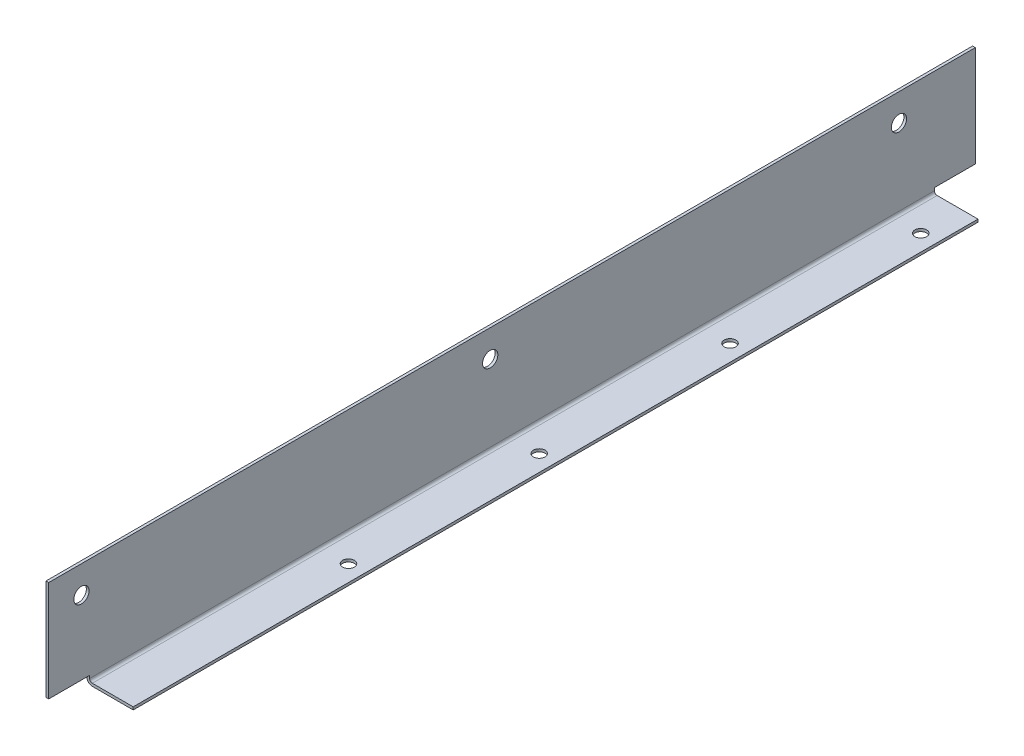
ISO-10303-21;
HEADER;
FILE_DESCRIPTION(('STEP AP214'),'2;1');
FILE_NAME('part.step','',(''),(''),'','','');
FILE_SCHEMA(('AUTOMOTIVE_DESIGN { 1 0 10303 214 1 1 1 1 }'));
ENDSEC;
DATA;
#1=APPLICATION_CONTEXT('core data for automotive mechanical design processes');
#2=APPLICATION_PROTOCOL_DEFINITION('international standard','automotive_design',2000,#1);
#3=PRODUCT_CONTEXT('',#1,'mechanical');
#4=PRODUCT('Part','Part','',(#3));
#5=PRODUCT_RELATED_PRODUCT_CATEGORY('part','',(#4));
#6=PRODUCT_DEFINITION_FORMATION('','',#4);
#7=PRODUCT_DEFINITION_CONTEXT('part definition',#1,'design');
#8=PRODUCT_DEFINITION('design','',#6,#7);
#9=PRODUCT_DEFINITION_SHAPE('','',#8);
#10=(LENGTH_UNIT() NAMED_UNIT(*) SI_UNIT(.MILLI.,.METRE.));
#11=(NAMED_UNIT(*) PLANE_ANGLE_UNIT() SI_UNIT($,.RADIAN.));
#12=(NAMED_UNIT(*) SI_UNIT($,.STERADIAN.) SOLID_ANGLE_UNIT());
#13=UNCERTAINTY_MEASURE_WITH_UNIT(LENGTH_MEASURE(1.E-05),#10,'distance_accuracy_value','');
#14=(GEOMETRIC_REPRESENTATION_CONTEXT(3) GLOBAL_UNCERTAINTY_ASSIGNED_CONTEXT((#13)) GLOBAL_UNIT_ASSIGNED_CONTEXT((#10,
#11,#12)) REPRESENTATION_CONTEXT('',''));
#15=CARTESIAN_POINT('',(0.,0.,0.));
#16=DIRECTION('',(0.,0.,1.));
#17=DIRECTION('',(1.,0.,0.));
#18=AXIS2_PLACEMENT_3D('',#15,#16,#17);
#19=CARTESIAN_POINT('',(17.,1.,340.));
#20=DIRECTION('',(-1.,0.,0.));
#21=DIRECTION('',(0.,0.,1.));
#22=AXIS2_PLACEMENT_3D('',#19,#20,#21);
#23=PLANE('',#22);
#24=DIRECTION('',(0.,0.,-1.));
#25=VECTOR('',#24,1.);
#26=CARTESIAN_POINT('',(17.,0.,340.));
#27=LINE('',#26,#25);
#28=CARTESIAN_POINT('',(17.,0.,325.));
#29=VERTEX_POINT('',#28);
#30=CARTESIAN_POINT('',(17.,0.,15.));
#31=VERTEX_POINT('',#30);
#32=EDGE_CURVE('E137',#29,#31,#27,.T.);
#33=ORIENTED_EDGE('',*,*,#32,.T.);
#34=DIRECTION('',(0.,1.,0.));
#35=VECTOR('',#34,1.);
#36=CARTESIAN_POINT('',(17.,1.,15.));
#37=LINE('',#36,#35);
#38=CARTESIAN_POINT('',(17.,1.,15.));
#39=VERTEX_POINT('',#38);
#40=EDGE_CURVE('E119',#31,#39,#37,.T.);
#41=ORIENTED_EDGE('',*,*,#40,.T.);
#42=DIRECTION('',(0.,0.,-1.));
#43=VECTOR('',#42,1.);
#44=CARTESIAN_POINT('',(17.,1.,340.));
#45=LINE('',#44,#43);
#46=CARTESIAN_POINT('',(17.,1.,325.));
#47=VERTEX_POINT('',#46);
#48=EDGE_CURVE('E169',#47,#39,#45,.T.);
#49=ORIENTED_EDGE('',*,*,#48,.F.);
#50=DIRECTION('',(0.,-1.,0.));
#51=VECTOR('',#50,1.);
#52=CARTESIAN_POINT('',(17.,1.,325.));
#53=LINE('',#52,#51);
#54=EDGE_CURVE('E143',#47,#29,#53,.T.);
#55=ORIENTED_EDGE('',*,*,#54,.T.);
#56=EDGE_LOOP('',(#33,#41,#49,#55));
#57=FACE_BOUND('',#56,.T.);
#58=ADVANCED_FACE('F31',(#57),#23,.F.);
#59=CARTESIAN_POINT('',(17.,1.,340.));
#60=DIRECTION('',(0.,-1.,0.));
#61=DIRECTION('',(0.,0.,-1.));
#62=AXIS2_PLACEMENT_3D('',#59,#60,#61);
#63=PLANE('',#62);
#64=CARTESIAN_POINT('',(11.,1.,240.));
#65=DIRECTION('',(0.,-1.,0.));
#66=DIRECTION('',(0.,0.,-1.));
#67=AXIS2_PLACEMENT_3D('',#64,#65,#66);
#68=CIRCLE('',#67,2.15000000000001);
#69=CARTESIAN_POINT('',(11.,1.,237.85));
#70=VERTEX_POINT('',#69);
#71=EDGE_CURVE('E243',#70,#70,#68,.T.);
#72=ORIENTED_EDGE('',*,*,#71,.T.);
#73=EDGE_LOOP('',(#72));
#74=FACE_BOUND('',#73,.T.);
#75=CARTESIAN_POINT('',(11.,1.,170.));
#76=DIRECTION('',(0.,-1.,0.));
#77=DIRECTION('',(0.,0.,-1.));
#78=AXIS2_PLACEMENT_3D('',#75,#76,#77);
#79=CIRCLE('',#78,2.15000000000001);
#80=CARTESIAN_POINT('',(11.,1.,167.85));
#81=VERTEX_POINT('',#80);
#82=EDGE_CURVE('E249',#81,#81,#79,.T.);
#83=ORIENTED_EDGE('',*,*,#82,.T.);
#84=EDGE_LOOP('',(#83));
#85=FACE_BOUND('',#84,.T.);
#86=CARTESIAN_POINT('',(11.,1.,100.));
#87=DIRECTION('',(0.,-1.,0.));
#88=DIRECTION('',(0.,0.,-1.));
#89=AXIS2_PLACEMENT_3D('',#86,#87,#88);
#90=CIRCLE('',#89,2.15);
#91=CARTESIAN_POINT('',(11.,1.,97.85));
#92=VERTEX_POINT('',#91);
#93=EDGE_CURVE('E255',#92,#92,#90,.T.);
#94=ORIENTED_EDGE('',*,*,#93,.T.);
#95=EDGE_LOOP('',(#94));
#96=FACE_BOUND('',#95,.T.);
#97=CARTESIAN_POINT('',(11.,1.,30.));
#98=DIRECTION('',(0.,-1.,0.));
#99=DIRECTION('',(0.,0.,-1.));
#100=AXIS2_PLACEMENT_3D('',#97,#98,#99);
#101=CIRCLE('',#100,2.15);
#102=CARTESIAN_POINT('',(11.,1.,27.85));
#103=VERTEX_POINT('',#102);
#104=EDGE_CURVE('E261',#103,#103,#101,.T.);
#105=ORIENTED_EDGE('',*,*,#104,.T.);
#106=EDGE_LOOP('',(#105));
#107=FACE_BOUND('',#106,.T.);
#108=ORIENTED_EDGE('',*,*,#48,.T.);
#109=DIRECTION('',(-1.,0.,0.));
#110=VECTOR('',#109,1.);
#111=CARTESIAN_POINT('',(17.,1.,15.));
#112=LINE('',#111,#110);
#113=CARTESIAN_POINT('',(2.00000000000002,1.,15.));
#114=VERTEX_POINT('',#113);
#115=EDGE_CURVE('E125',#39,#114,#112,.T.);
#116=ORIENTED_EDGE('',*,*,#115,.T.);
#117=DIRECTION('',(0.,0.,-1.));
#118=VECTOR('',#117,1.);
#119=CARTESIAN_POINT('',(2.00000000000002,1.,340.));
#120=LINE('',#119,#118);
#121=CARTESIAN_POINT('',(2.00000000000002,1.,325.));
#122=VERTEX_POINT('',#121);
#123=EDGE_CURVE('E166',#122,#114,#120,.T.);
#124=ORIENTED_EDGE('',*,*,#123,.F.);
#125=DIRECTION('',(1.,0.,0.));
#126=VECTOR('',#125,1.);
#127=CARTESIAN_POINT('',(17.,1.,325.));
#128=LINE('',#127,#126);
#129=EDGE_CURVE('E236',#122,#47,#128,.T.);
#130=ORIENTED_EDGE('',*,*,#129,.T.);
#131=EDGE_LOOP('',(#108,#116,#124,#130));
#132=FACE_BOUND('',#131,.T.);
#133=ADVANCED_FACE('F297',(#74,#85,#96,#107,#132),#63,.F.);
#134=CARTESIAN_POINT('',(2.,2.,340.));
#135=DIRECTION('',(0.,0.,-1.));
#136=DIRECTION('',(-1.,0.,0.));
#137=AXIS2_PLACEMENT_3D('',#134,#135,#136);
#138=CYLINDRICAL_SURFACE('',#137,1.);
#139=ORIENTED_EDGE('',*,*,#123,.T.);
#140=CARTESIAN_POINT('',(2.,2.,15.));
#141=DIRECTION('',(0.,0.,1.));
#142=DIRECTION('',(1.,0.,0.));
#143=AXIS2_PLACEMENT_3D('',#140,#141,#142);
#144=CIRCLE('',#143,1.);
#145=CARTESIAN_POINT('',(1.,2.00000000000001,15.));
#146=VERTEX_POINT('',#145);
#147=EDGE_CURVE('E215',#114,#146,#144,.F.);
#148=ORIENTED_EDGE('',*,*,#147,.T.);
#149=DIRECTION('',(0.,0.,-1.));
#150=VECTOR('',#149,1.);
#151=CARTESIAN_POINT('',(1.,2.00000000000001,340.));
#152=LINE('',#151,#150);
#153=CARTESIAN_POINT('',(1.,2.00000000000001,325.));
#154=VERTEX_POINT('',#153);
#155=EDGE_CURVE('E163',#154,#146,#152,.T.);
#156=ORIENTED_EDGE('',*,*,#155,.F.);
#157=CARTESIAN_POINT('',(2.,2.,325.));
#158=DIRECTION('',(0.,0.,-1.));
#159=DIRECTION('',(-1.,0.,0.));
#160=AXIS2_PLACEMENT_3D('',#157,#158,#159);
#161=CIRCLE('',#160,1.);
#162=EDGE_CURVE('E233',#154,#122,#161,.F.);
#163=ORIENTED_EDGE('',*,*,#162,.T.);
#164=EDGE_LOOP('',(#139,#148,#156,#163));
#165=FACE_BOUND('',#164,.T.);
#166=ADVANCED_FACE('F301',(#165),#138,.F.);
#167=CARTESIAN_POINT('',(1.,2.00000000000001,340.));
#168=DIRECTION('',(-1.,0.,0.));
#169=DIRECTION('',(0.,0.,1.));
#170=AXIS2_PLACEMENT_3D('',#167,#168,#169);
#171=PLANE('',#170);
#172=CARTESIAN_POINT('',(1.,30.,328.));
#173=DIRECTION('',(-1.,0.,0.));
#174=DIRECTION('',(0.,0.,1.));
#175=AXIS2_PLACEMENT_3D('',#172,#173,#174);
#176=CIRCLE('',#175,2.80000000000001);
#177=CARTESIAN_POINT('',(1.,30.,330.8));
#178=VERTEX_POINT('',#177);
#179=EDGE_CURVE('E267',#178,#178,#176,.T.);
#180=ORIENTED_EDGE('',*,*,#179,.T.);
#181=EDGE_LOOP('',(#180));
#182=FACE_BOUND('',#181,.T.);
#183=CARTESIAN_POINT('',(1.,30.,178.));
#184=DIRECTION('',(-1.,0.,0.));
#185=DIRECTION('',(0.,0.,1.));
#186=AXIS2_PLACEMENT_3D('',#183,#184,#185);
#187=CIRCLE('',#186,2.80000000000001);
#188=CARTESIAN_POINT('',(1.,30.,180.8));
#189=VERTEX_POINT('',#188);
#190=EDGE_CURVE('E273',#189,#189,#187,.T.);
#191=ORIENTED_EDGE('',*,*,#190,.T.);
#192=EDGE_LOOP('',(#191));
#193=FACE_BOUND('',#192,.T.);
#194=CARTESIAN_POINT('',(1.,30.,28.));
#195=DIRECTION('',(-1.,0.,0.));
#196=DIRECTION('',(0.,0.,1.));
#197=AXIS2_PLACEMENT_3D('',#194,#195,#196);
#198=CIRCLE('',#197,2.8);
#199=CARTESIAN_POINT('',(1.,30.,30.8));
#200=VERTEX_POINT('',#199);
#201=EDGE_CURVE('E186',#200,#200,#198,.T.);
#202=ORIENTED_EDGE('',*,*,#201,.T.);
#203=EDGE_LOOP('',(#202));
#204=FACE_BOUND('',#203,.T.);
#205=ORIENTED_EDGE('',*,*,#155,.T.);
#206=DIRECTION('',(0.,1.,0.));
#207=VECTOR('',#206,1.);
#208=CARTESIAN_POINT('',(1.,2.00000000000001,15.));
#209=LINE('',#208,#207);
#210=CARTESIAN_POINT('',(1.,3.,15.));
#211=VERTEX_POINT('',#210);
#212=EDGE_CURVE('E205',#146,#211,#209,.T.);
#213=ORIENTED_EDGE('',*,*,#212,.T.);
#214=DIRECTION('',(0.,0.,-1.));
#215=VECTOR('',#214,1.);
#216=CARTESIAN_POINT('',(1.,3.,340.));
#217=LINE('',#216,#215);
#218=CARTESIAN_POINT('',(1.,3.,0.));
#219=VERTEX_POINT('',#218);
#220=EDGE_CURVE('E202',#211,#219,#217,.T.);
#221=ORIENTED_EDGE('',*,*,#220,.T.);
#222=DIRECTION('',(0.,1.,0.));
#223=VECTOR('',#222,1.);
#224=CARTESIAN_POINT('',(1.,2.00000000000001,0.));
#225=LINE('',#224,#223);
#226=CARTESIAN_POINT('',(1.,40.,0.));
#227=VERTEX_POINT('',#226);
#228=EDGE_CURVE('E189',#219,#227,#225,.T.);
#229=ORIENTED_EDGE('',*,*,#228,.T.);
#230=DIRECTION('',(0.,0.,-1.));
#231=VECTOR('',#230,1.);
#232=CARTESIAN_POINT('',(1.,40.,340.));
#233=LINE('',#232,#231);
#234=CARTESIAN_POINT('',(1.,40.,340.));
#235=VERTEX_POINT('',#234);
#236=EDGE_CURVE('E160',#235,#227,#233,.T.);
#237=ORIENTED_EDGE('',*,*,#236,.F.);
#238=DIRECTION('',(0.,1.,0.));
#239=VECTOR('',#238,1.);
#240=CARTESIAN_POINT('',(1.,2.00000000000001,340.));
#241=LINE('',#240,#239);
#242=CARTESIAN_POINT('',(1.,3.,340.));
#243=VERTEX_POINT('',#242);
#244=EDGE_CURVE('E173',#243,#235,#241,.T.);
#245=ORIENTED_EDGE('',*,*,#244,.F.);
#246=DIRECTION('',(0.,0.,-1.));
#247=VECTOR('',#246,1.);
#248=CARTESIAN_POINT('',(1.,3.,340.));
#249=LINE('',#248,#247);
#250=CARTESIAN_POINT('',(0.999999999999999,3.,325.));
#251=VERTEX_POINT('',#250);
#252=EDGE_CURVE('E52',#243,#251,#249,.T.);
#253=ORIENTED_EDGE('',*,*,#252,.T.);
#254=DIRECTION('',(0.,-1.,0.));
#255=VECTOR('',#254,1.);
#256=CARTESIAN_POINT('',(1.,2.00000000000001,325.));
#257=LINE('',#256,#255);
#258=EDGE_CURVE('E231',#251,#154,#257,.T.);
#259=ORIENTED_EDGE('',*,*,#258,.T.);
#260=EDGE_LOOP('',(#205,#213,#221,#229,#237,#245,#253,#259));
#261=FACE_BOUND('',#260,.T.);
#262=ADVANCED_FACE('F178',(#182,#193,#204,#261),#171,.F.);
#263=CARTESIAN_POINT('',(0.,40.,340.));
#264=DIRECTION('',(0.,-1.,0.));
#265=DIRECTION('',(0.,0.,-1.));
#266=AXIS2_PLACEMENT_3D('',#263,#264,#265);
#267=PLANE('',#266);
#268=DIRECTION('',(-1.,0.,0.));
#269=VECTOR('',#268,1.);
#270=CARTESIAN_POINT('',(0.,40.,0.));
#271=LINE('',#270,#269);
#272=CARTESIAN_POINT('',(0.,40.,0.));
#273=VERTEX_POINT('',#272);
#274=EDGE_CURVE('E184',#227,#273,#271,.T.);
#275=ORIENTED_EDGE('',*,*,#274,.T.);
#276=DIRECTION('',(0.,0.,-1.));
#277=VECTOR('',#276,1.);
#278=CARTESIAN_POINT('',(0.,40.,340.));
#279=LINE('',#278,#277);
#280=CARTESIAN_POINT('',(0.,40.,340.));
#281=VERTEX_POINT('',#280);
#282=EDGE_CURVE('E157',#281,#273,#279,.T.);
#283=ORIENTED_EDGE('',*,*,#282,.F.);
#284=DIRECTION('',(-1.,0.,0.));
#285=VECTOR('',#284,1.);
#286=CARTESIAN_POINT('',(0.,40.,340.));
#287=LINE('',#286,#285);
#288=EDGE_CURVE('E149',#235,#281,#287,.T.);
#289=ORIENTED_EDGE('',*,*,#288,.F.);
#290=ORIENTED_EDGE('',*,*,#236,.T.);
#291=EDGE_LOOP('',(#275,#283,#289,#290));
#292=FACE_BOUND('',#291,.T.);
#293=ADVANCED_FACE('F193',(#292),#267,.F.);
#294=CARTESIAN_POINT('',(0.,2.00000000000001,340.));
#295=DIRECTION('',(1.,0.,0.));
#296=DIRECTION('',(0.,0.,-1.));
#297=AXIS2_PLACEMENT_3D('',#294,#295,#296);
#298=PLANE('',#297);
#299=CARTESIAN_POINT('',(0.,30.,328.));
#300=DIRECTION('',(-1.,0.,0.));
#301=DIRECTION('',(0.,0.,1.));
#302=AXIS2_PLACEMENT_3D('',#299,#300,#301);
#303=CIRCLE('',#302,2.80000000000001);
#304=CARTESIAN_POINT('',(0.,30.,330.8));
#305=VERTEX_POINT('',#304);
#306=EDGE_CURVE('E264',#305,#305,#303,.T.);
#307=ORIENTED_EDGE('',*,*,#306,.F.);
#308=EDGE_LOOP('',(#307));
#309=FACE_BOUND('',#308,.T.);
#310=CARTESIAN_POINT('',(0.,30.,178.));
#311=DIRECTION('',(-1.,0.,0.));
#312=DIRECTION('',(0.,0.,1.));
#313=AXIS2_PLACEMENT_3D('',#310,#311,#312);
#314=CIRCLE('',#313,2.80000000000001);
#315=CARTESIAN_POINT('',(0.,30.,180.8));
#316=VERTEX_POINT('',#315);
#317=EDGE_CURVE('E270',#316,#316,#314,.T.);
#318=ORIENTED_EDGE('',*,*,#317,.F.);
#319=EDGE_LOOP('',(#318));
#320=FACE_BOUND('',#319,.T.);
#321=CARTESIAN_POINT('',(0.,30.,28.));
#322=DIRECTION('',(-1.,0.,0.));
#323=DIRECTION('',(0.,0.,1.));
#324=AXIS2_PLACEMENT_3D('',#321,#322,#323);
#325=CIRCLE('',#324,2.8);
#326=CARTESIAN_POINT('',(0.,30.,30.8));
#327=VERTEX_POINT('',#326);
#328=EDGE_CURVE('E275',#327,#327,#325,.T.);
#329=ORIENTED_EDGE('',*,*,#328,.F.);
#330=EDGE_LOOP('',(#329));
#331=FACE_BOUND('',#330,.T.);
#332=DIRECTION('',(0.,0.,1.));
#333=VECTOR('',#332,1.);
#334=CARTESIAN_POINT('',(0.,3.,340.));
#335=LINE('',#334,#333);
#336=CARTESIAN_POINT('',(0.,3.,0.));
#337=VERTEX_POINT('',#336);
#338=CARTESIAN_POINT('',(0.,3.,15.));
#339=VERTEX_POINT('',#338);
#340=EDGE_CURVE('E44',#337,#339,#335,.T.);
#341=ORIENTED_EDGE('',*,*,#340,.T.);
#342=DIRECTION('',(0.,-1.,0.));
#343=VECTOR('',#342,1.);
#344=CARTESIAN_POINT('',(0.,2.00000000000001,15.));
#345=LINE('',#344,#343);
#346=CARTESIAN_POINT('',(0.,2.00000000000001,15.));
#347=VERTEX_POINT('',#346);
#348=EDGE_CURVE('E208',#339,#347,#345,.T.);
#349=ORIENTED_EDGE('',*,*,#348,.T.);
#350=DIRECTION('',(0.,0.,-1.));
#351=VECTOR('',#350,1.);
#352=CARTESIAN_POINT('',(0.,2.00000000000001,340.));
#353=LINE('',#352,#351);
#354=CARTESIAN_POINT('',(0.,2.,325.));
#355=VERTEX_POINT('',#354);
#356=EDGE_CURVE('E146',#355,#347,#353,.T.);
#357=ORIENTED_EDGE('',*,*,#356,.F.);
#358=DIRECTION('',(0.,1.,0.));
#359=VECTOR('',#358,1.);
#360=CARTESIAN_POINT('',(0.,2.00000000000001,325.));
#361=LINE('',#360,#359);
#362=CARTESIAN_POINT('',(0.,3.,325.));
#363=VERTEX_POINT('',#362);
#364=EDGE_CURVE('E228',#355,#363,#361,.T.);
#365=ORIENTED_EDGE('',*,*,#364,.T.);
#366=DIRECTION('',(0.,0.,1.));
#367=VECTOR('',#366,1.);
#368=CARTESIAN_POINT('',(0.,3.,340.));
#369=LINE('',#368,#367);
#370=CARTESIAN_POINT('',(0.,3.,340.));
#371=VERTEX_POINT('',#370);
#372=EDGE_CURVE('E221',#363,#371,#369,.T.);
#373=ORIENTED_EDGE('',*,*,#372,.T.);
#374=DIRECTION('',(0.,-1.,0.));
#375=VECTOR('',#374,1.);
#376=CARTESIAN_POINT('',(0.,2.00000000000001,340.));
#377=LINE('',#376,#375);
#378=EDGE_CURVE('E144',#281,#371,#377,.T.);
#379=ORIENTED_EDGE('',*,*,#378,.F.);
#380=ORIENTED_EDGE('',*,*,#282,.T.);
#381=DIRECTION('',(0.,-1.,0.));
#382=VECTOR('',#381,1.);
#383=CARTESIAN_POINT('',(0.,2.00000000000001,0.));
#384=LINE('',#383,#382);
#385=EDGE_CURVE('E152',#273,#337,#384,.T.);
#386=ORIENTED_EDGE('',*,*,#385,.T.);
#387=EDGE_LOOP('',(#341,#349,#357,#365,#373,#379,#380,#386));
#388=FACE_BOUND('',#387,.T.);
#389=ADVANCED_FACE('F198',(#309,#320,#331,#388),#298,.F.);
#390=CARTESIAN_POINT('',(2.,2.,340.));
#391=DIRECTION('',(0.,0.,-1.));
#392=DIRECTION('',(-1.,0.,0.));
#393=AXIS2_PLACEMENT_3D('',#390,#391,#392);
#394=CYLINDRICAL_SURFACE('',#393,2.);
#395=ORIENTED_EDGE('',*,*,#356,.T.);
#396=CARTESIAN_POINT('',(2.,2.,15.));
#397=DIRECTION('',(0.,0.,1.));
#398=DIRECTION('',(1.,0.,0.));
#399=AXIS2_PLACEMENT_3D('',#396,#397,#398);
#400=CIRCLE('',#399,2.);
#401=CARTESIAN_POINT('',(2.00000000000001,0.,15.));
#402=VERTEX_POINT('',#401);
#403=EDGE_CURVE('E206',#347,#402,#400,.T.);
#404=ORIENTED_EDGE('',*,*,#403,.T.);
#405=DIRECTION('',(0.,0.,-1.));
#406=VECTOR('',#405,1.);
#407=CARTESIAN_POINT('',(2.00000000000001,0.,340.));
#408=LINE('',#407,#406);
#409=CARTESIAN_POINT('',(2.00000000000001,0.,325.));
#410=VERTEX_POINT('',#409);
#411=EDGE_CURVE('E139',#410,#402,#408,.T.);
#412=ORIENTED_EDGE('',*,*,#411,.F.);
#413=CARTESIAN_POINT('',(2.,2.,325.));
#414=DIRECTION('',(0.,0.,-1.));
#415=DIRECTION('',(-1.,0.,0.));
#416=AXIS2_PLACEMENT_3D('',#413,#414,#415);
#417=CIRCLE('',#416,2.);
#418=EDGE_CURVE('E225',#410,#355,#417,.T.);
#419=ORIENTED_EDGE('',*,*,#418,.T.);
#420=EDGE_LOOP('',(#395,#404,#412,#419));
#421=FACE_BOUND('',#420,.T.);
#422=ADVANCED_FACE('F317',(#421),#394,.T.);
#423=CARTESIAN_POINT('',(17.,0.,340.));
#424=DIRECTION('',(0.,1.,0.));
#425=DIRECTION('',(-1.,0.,0.));
#426=AXIS2_PLACEMENT_3D('',#423,#424,#425);
#427=PLANE('',#426);
#428=CARTESIAN_POINT('',(11.,0.,240.));
#429=DIRECTION('',(0.,-1.,0.));
#430=DIRECTION('',(1.,0.,0.));
#431=AXIS2_PLACEMENT_3D('',#428,#429,#430);
#432=CIRCLE('',#431,2.15000000000001);
#433=CARTESIAN_POINT('',(13.15,0.,240.));
#434=VERTEX_POINT('',#433);
#435=EDGE_CURVE('E240',#434,#434,#432,.T.);
#436=ORIENTED_EDGE('',*,*,#435,.F.);
#437=EDGE_LOOP('',(#436));
#438=FACE_BOUND('',#437,.T.);
#439=CARTESIAN_POINT('',(11.,0.,170.));
#440=DIRECTION('',(0.,-1.,0.));
#441=DIRECTION('',(1.,0.,0.));
#442=AXIS2_PLACEMENT_3D('',#439,#440,#441);
#443=CIRCLE('',#442,2.15000000000001);
#444=CARTESIAN_POINT('',(13.15,0.,170.));
#445=VERTEX_POINT('',#444);
#446=EDGE_CURVE('E246',#445,#445,#443,.T.);
#447=ORIENTED_EDGE('',*,*,#446,.F.);
#448=EDGE_LOOP('',(#447));
#449=FACE_BOUND('',#448,.T.);
#450=CARTESIAN_POINT('',(11.,0.,100.));
#451=DIRECTION('',(0.,-1.,0.));
#452=DIRECTION('',(1.,0.,0.));
#453=AXIS2_PLACEMENT_3D('',#450,#451,#452);
#454=CIRCLE('',#453,2.15);
#455=CARTESIAN_POINT('',(13.15,0.,100.));
#456=VERTEX_POINT('',#455);
#457=EDGE_CURVE('E252',#456,#456,#454,.T.);
#458=ORIENTED_EDGE('',*,*,#457,.F.);
#459=EDGE_LOOP('',(#458));
#460=FACE_BOUND('',#459,.T.);
#461=CARTESIAN_POINT('',(11.,0.,30.));
#462=DIRECTION('',(0.,-1.,0.));
#463=DIRECTION('',(1.,0.,0.));
#464=AXIS2_PLACEMENT_3D('',#461,#462,#463);
#465=CIRCLE('',#464,2.15);
#466=CARTESIAN_POINT('',(13.15,0.,30.));
#467=VERTEX_POINT('',#466);
#468=EDGE_CURVE('E258',#467,#467,#465,.T.);
#469=ORIENTED_EDGE('',*,*,#468,.F.);
#470=EDGE_LOOP('',(#469));
#471=FACE_BOUND('',#470,.T.);
#472=ORIENTED_EDGE('',*,*,#411,.T.);
#473=DIRECTION('',(-1.,0.,0.));
#474=VECTOR('',#473,1.);
#475=CARTESIAN_POINT('',(-17.2737898080727,0.,15.));
#476=LINE('',#475,#474);
#477=EDGE_CURVE('E122',#31,#402,#476,.T.);
#478=ORIENTED_EDGE('',*,*,#477,.F.);
#479=ORIENTED_EDGE('',*,*,#32,.F.);
#480=DIRECTION('',(1.,0.,0.));
#481=VECTOR('',#480,1.);
#482=CARTESIAN_POINT('',(-12.3496219302459,0.,325.));
#483=LINE('',#482,#481);
#484=EDGE_CURVE('E130',#410,#29,#483,.T.);
#485=ORIENTED_EDGE('',*,*,#484,.F.);
#486=EDGE_LOOP('',(#472,#478,#479,#485));
#487=FACE_BOUND('',#486,.T.);
#488=ADVANCED_FACE('F135',(#438,#449,#460,#471,#487),#427,.F.);
#489=CARTESIAN_POINT('',(2.,2.,340.));
#490=DIRECTION('',(0.,0.,-1.));
#491=DIRECTION('',(-1.,0.,0.));
#492=AXIS2_PLACEMENT_3D('',#489,#490,#491);
#493=PLANE('',#492);
#494=ORIENTED_EDGE('',*,*,#378,.T.);
#495=DIRECTION('',(1.,0.,0.));
#496=VECTOR('',#495,1.);
#497=CARTESIAN_POINT('',(2.,3.,340.));
#498=LINE('',#497,#496);
#499=EDGE_CURVE('E38',#371,#243,#498,.T.);
#500=ORIENTED_EDGE('',*,*,#499,.T.);
#501=ORIENTED_EDGE('',*,*,#244,.T.);
#502=ORIENTED_EDGE('',*,*,#288,.T.);
#503=EDGE_LOOP('',(#494,#500,#501,#502));
#504=FACE_BOUND('',#503,.T.);
#505=ADVANCED_FACE('F172',(#504),#493,.F.);
#506=CARTESIAN_POINT('',(2.,2.,0.));
#507=DIRECTION('',(0.,0.,-1.));
#508=DIRECTION('',(-1.,0.,0.));
#509=AXIS2_PLACEMENT_3D('',#506,#507,#508);
#510=PLANE('',#509);
#511=DIRECTION('',(1.,0.,0.));
#512=VECTOR('',#511,1.);
#513=CARTESIAN_POINT('',(2.,3.,0.));
#514=LINE('',#513,#512);
#515=EDGE_CURVE('E11',#337,#219,#514,.T.);
#516=ORIENTED_EDGE('',*,*,#515,.F.);
#517=ORIENTED_EDGE('',*,*,#385,.F.);
#518=ORIENTED_EDGE('',*,*,#274,.F.);
#519=ORIENTED_EDGE('',*,*,#228,.F.);
#520=EDGE_LOOP('',(#516,#517,#518,#519));
#521=FACE_BOUND('',#520,.T.);
#522=ADVANCED_FACE('F199',(#521),#510,.T.);
#523=CARTESIAN_POINT('',(340.,30.,28.));
#524=DIRECTION('',(-1.,0.,0.));
#525=DIRECTION('',(0.,0.,1.));
#526=AXIS2_PLACEMENT_3D('',#523,#524,#525);
#527=CYLINDRICAL_SURFACE('',#526,2.8);
#528=ORIENTED_EDGE('',*,*,#328,.T.);
#529=EDGE_LOOP('',(#528));
#530=FACE_BOUND('',#529,.T.);
#531=ORIENTED_EDGE('',*,*,#201,.F.);
#532=EDGE_LOOP('',(#531));
#533=FACE_BOUND('',#532,.T.);
#534=ADVANCED_FACE('F283',(#530,#533),#527,.F.);
#535=CARTESIAN_POINT('',(340.,30.,178.));
#536=DIRECTION('',(-1.,0.,0.));
#537=DIRECTION('',(0.,0.,1.));
#538=AXIS2_PLACEMENT_3D('',#535,#536,#537);
#539=CYLINDRICAL_SURFACE('',#538,2.80000000000001);
#540=ORIENTED_EDGE('',*,*,#317,.T.);
#541=EDGE_LOOP('',(#540));
#542=FACE_BOUND('',#541,.T.);
#543=ORIENTED_EDGE('',*,*,#190,.F.);
#544=EDGE_LOOP('',(#543));
#545=FACE_BOUND('',#544,.T.);
#546=ADVANCED_FACE('F285',(#542,#545),#539,.F.);
#547=CARTESIAN_POINT('',(340.,30.,328.));
#548=DIRECTION('',(-1.,0.,0.));
#549=DIRECTION('',(0.,0.,1.));
#550=AXIS2_PLACEMENT_3D('',#547,#548,#549);
#551=CYLINDRICAL_SURFACE('',#550,2.80000000000001);
#552=ORIENTED_EDGE('',*,*,#306,.T.);
#553=EDGE_LOOP('',(#552));
#554=FACE_BOUND('',#553,.T.);
#555=ORIENTED_EDGE('',*,*,#179,.F.);
#556=EDGE_LOOP('',(#555));
#557=FACE_BOUND('',#556,.T.);
#558=ADVANCED_FACE('F291',(#554,#557),#551,.F.);
#559=CARTESIAN_POINT('',(11.,340.,30.));
#560=DIRECTION('',(0.,-1.,0.));
#561=DIRECTION('',(1.,0.,0.));
#562=AXIS2_PLACEMENT_3D('',#559,#560,#561);
#563=CYLINDRICAL_SURFACE('',#562,2.15);
#564=ORIENTED_EDGE('',*,*,#468,.T.);
#565=EDGE_LOOP('',(#564));
#566=FACE_BOUND('',#565,.T.);
#567=ORIENTED_EDGE('',*,*,#104,.F.);
#568=EDGE_LOOP('',(#567));
#569=FACE_BOUND('',#568,.T.);
#570=ADVANCED_FACE('F386',(#566,#569),#563,.F.);
#571=CARTESIAN_POINT('',(11.,340.,100.));
#572=DIRECTION('',(0.,-1.,0.));
#573=DIRECTION('',(1.,0.,0.));
#574=AXIS2_PLACEMENT_3D('',#571,#572,#573);
#575=CYLINDRICAL_SURFACE('',#574,2.15);
#576=ORIENTED_EDGE('',*,*,#457,.T.);
#577=EDGE_LOOP('',(#576));
#578=FACE_BOUND('',#577,.T.);
#579=ORIENTED_EDGE('',*,*,#93,.F.);
#580=EDGE_LOOP('',(#579));
#581=FACE_BOUND('',#580,.T.);
#582=ADVANCED_FACE('F382',(#578,#581),#575,.F.);
#583=CARTESIAN_POINT('',(11.,340.,170.));
#584=DIRECTION('',(0.,-1.,0.));
#585=DIRECTION('',(1.,0.,0.));
#586=AXIS2_PLACEMENT_3D('',#583,#584,#585);
#587=CYLINDRICAL_SURFACE('',#586,2.15000000000001);
#588=ORIENTED_EDGE('',*,*,#446,.T.);
#589=EDGE_LOOP('',(#588));
#590=FACE_BOUND('',#589,.T.);
#591=ORIENTED_EDGE('',*,*,#82,.F.);
#592=EDGE_LOOP('',(#591));
#593=FACE_BOUND('',#592,.T.);
#594=ADVANCED_FACE('F378',(#590,#593),#587,.F.);
#595=CARTESIAN_POINT('',(11.,340.,240.));
#596=DIRECTION('',(0.,-1.,0.));
#597=DIRECTION('',(1.,0.,0.));
#598=AXIS2_PLACEMENT_3D('',#595,#596,#597);
#599=CYLINDRICAL_SURFACE('',#598,2.15000000000001);
#600=ORIENTED_EDGE('',*,*,#435,.T.);
#601=EDGE_LOOP('',(#600));
#602=FACE_BOUND('',#601,.T.);
#603=ORIENTED_EDGE('',*,*,#71,.F.);
#604=EDGE_LOOP('',(#603));
#605=FACE_BOUND('',#604,.T.);
#606=ADVANCED_FACE('F345',(#602,#605),#599,.F.);
#607=CARTESIAN_POINT('',(-12.3496219302459,3.,325.));
#608=DIRECTION('',(0.,0.,-1.));
#609=DIRECTION('',(-1.,0.,0.));
#610=AXIS2_PLACEMENT_3D('',#607,#608,#609);
#611=PLANE('',#610);
#612=ORIENTED_EDGE('',*,*,#129,.F.);
#613=ORIENTED_EDGE('',*,*,#162,.F.);
#614=ORIENTED_EDGE('',*,*,#258,.F.);
#615=DIRECTION('',(1.,0.,0.));
#616=VECTOR('',#615,1.);
#617=CARTESIAN_POINT('',(-12.3496219302459,3.,325.));
#618=LINE('',#617,#616);
#619=EDGE_CURVE('E219',#363,#251,#618,.T.);
#620=ORIENTED_EDGE('',*,*,#619,.F.);
#621=ORIENTED_EDGE('',*,*,#364,.F.);
#622=ORIENTED_EDGE('',*,*,#418,.F.);
#623=ORIENTED_EDGE('',*,*,#484,.T.);
#624=ORIENTED_EDGE('',*,*,#54,.F.);
#625=EDGE_LOOP('',(#612,#613,#614,#620,#621,#622,#623,#624));
#626=FACE_BOUND('',#625,.T.);
#627=ADVANCED_FACE('F339',(#626),#611,.F.);
#628=CARTESIAN_POINT('',(-12.3496219302459,3.,345.655925127723));
#629=DIRECTION('',(0.,1.,0.));
#630=DIRECTION('',(-1.,0.,0.));
#631=AXIS2_PLACEMENT_3D('',#628,#629,#630);
#632=PLANE('',#631);
#633=ORIENTED_EDGE('',*,*,#499,.F.);
#634=ORIENTED_EDGE('',*,*,#372,.F.);
#635=ORIENTED_EDGE('',*,*,#619,.T.);
#636=ORIENTED_EDGE('',*,*,#252,.F.);
#637=EDGE_LOOP('',(#633,#634,#635,#636));
#638=FACE_BOUND('',#637,.T.);
#639=ADVANCED_FACE('F344',(#638),#632,.F.);
#640=CARTESIAN_POINT('',(-17.2737898080727,3.,15.));
#641=DIRECTION('',(0.,0.,1.));
#642=DIRECTION('',(1.,0.,0.));
#643=AXIS2_PLACEMENT_3D('',#640,#641,#642);
#644=PLANE('',#643);
#645=ORIENTED_EDGE('',*,*,#477,.T.);
#646=ORIENTED_EDGE('',*,*,#403,.F.);
#647=ORIENTED_EDGE('',*,*,#348,.F.);
#648=DIRECTION('',(-1.,0.,0.));
#649=VECTOR('',#648,1.);
#650=CARTESIAN_POINT('',(-17.2737898080727,3.,15.));
#651=LINE('',#650,#649);
#652=EDGE_CURVE('E140',#211,#339,#651,.T.);
#653=ORIENTED_EDGE('',*,*,#652,.F.);
#654=ORIENTED_EDGE('',*,*,#212,.F.);
#655=ORIENTED_EDGE('',*,*,#147,.F.);
#656=ORIENTED_EDGE('',*,*,#115,.F.);
#657=ORIENTED_EDGE('',*,*,#40,.F.);
#658=EDGE_LOOP('',(#645,#646,#647,#653,#654,#655,#656,#657));
#659=FACE_BOUND('',#658,.T.);
#660=ADVANCED_FACE('F121',(#659),#644,.F.);
#661=CARTESIAN_POINT('',(-17.2737898080727,3.,15.));
#662=DIRECTION('',(0.,1.,0.));
#663=DIRECTION('',(-1.,0.,0.));
#664=AXIS2_PLACEMENT_3D('',#661,#662,#663);
#665=PLANE('',#664);
#666=ORIENTED_EDGE('',*,*,#652,.T.);
#667=ORIENTED_EDGE('',*,*,#340,.F.);
#668=ORIENTED_EDGE('',*,*,#515,.T.);
#669=ORIENTED_EDGE('',*,*,#220,.F.);
#670=EDGE_LOOP('',(#666,#667,#668,#669));
#671=FACE_BOUND('',#670,.T.);
#672=ADVANCED_FACE('F201',(#671),#665,.F.);
#673=CLOSED_SHELL('',(#58,#133,#166,#262,#293,#389,#422,#488,#505,#522,#534,#546,#558,#570,#582,
#594,#606,#627,#639,#660,#672));
#674=MANIFOLD_SOLID_BREP('B2',#673);
#675=ADVANCED_BREP_SHAPE_REPRESENTATION('',(#18,#674),#14);
#676=SHAPE_DEFINITION_REPRESENTATION(#9,#675);
ENDSEC;
END-ISO-10303-21;
